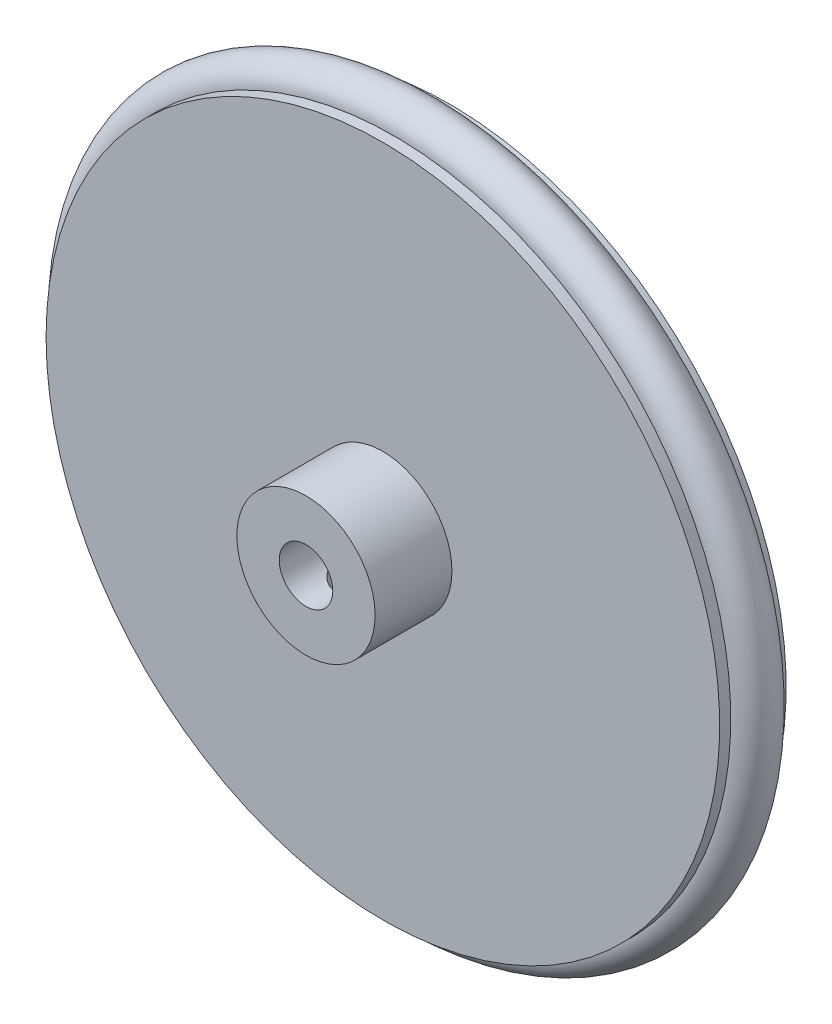
ISO-10303-21;
HEADER;
FILE_DESCRIPTION(('STEP AP214'),'2;1');
FILE_NAME('part.step','',(''),(''),'','','');
FILE_SCHEMA(('AUTOMOTIVE_DESIGN { 1 0 10303 214 1 1 1 1 }'));
ENDSEC;
DATA;
#1=APPLICATION_CONTEXT('core data for automotive mechanical design processes');
#2=APPLICATION_PROTOCOL_DEFINITION('international standard','automotive_design',2000,#1);
#3=PRODUCT_CONTEXT('',#1,'mechanical');
#4=PRODUCT('Part','Part','',(#3));
#5=PRODUCT_RELATED_PRODUCT_CATEGORY('part','',(#4));
#6=PRODUCT_DEFINITION_FORMATION('','',#4);
#7=PRODUCT_DEFINITION_CONTEXT('part definition',#1,'design');
#8=PRODUCT_DEFINITION('design','',#6,#7);
#9=PRODUCT_DEFINITION_SHAPE('','',#8);
#10=(LENGTH_UNIT() NAMED_UNIT(*) SI_UNIT(.MILLI.,.METRE.));
#11=(NAMED_UNIT(*) PLANE_ANGLE_UNIT() SI_UNIT($,.RADIAN.));
#12=(NAMED_UNIT(*) SI_UNIT($,.STERADIAN.) SOLID_ANGLE_UNIT());
#13=UNCERTAINTY_MEASURE_WITH_UNIT(LENGTH_MEASURE(1.E-05),#10,'distance_accuracy_value','');
#14=(GEOMETRIC_REPRESENTATION_CONTEXT(3) GLOBAL_UNCERTAINTY_ASSIGNED_CONTEXT((#13)) GLOBAL_UNIT_ASSIGNED_CONTEXT((#10,
#11,#12)) REPRESENTATION_CONTEXT('',''));
#15=CARTESIAN_POINT('',(0.,0.,0.));
#16=DIRECTION('',(0.,0.,1.));
#17=DIRECTION('',(1.,0.,0.));
#18=AXIS2_PLACEMENT_3D('',#15,#16,#17);
#19=CARTESIAN_POINT('',(0.,0.,3.85));
#20=DIRECTION('',(0.,0.,-1.));
#21=DIRECTION('',(-1.,0.,0.));
#22=AXIS2_PLACEMENT_3D('',#19,#20,#21);
#23=CYLINDRICAL_SURFACE('',#22,39.);
#24=CARTESIAN_POINT('',(0.,0.,2.56123692555145));
#25=DIRECTION('',(0.,0.,-1.));
#26=DIRECTION('',(-1.,0.,0.));
#27=AXIS2_PLACEMENT_3D('',#24,#25,#26);
#28=CIRCLE('',#27,39.);
#29=CARTESIAN_POINT('',(-39.,0.,2.56123692555145));
#30=VERTEX_POINT('',#29);
#31=EDGE_CURVE('E65',#30,#30,#28,.F.);
#32=CARTESIAN_POINT('',(0.,0.,3.85));
#33=DIRECTION('',(0.,0.,1.));
#34=DIRECTION('',(1.,0.,0.));
#35=AXIS2_PLACEMENT_3D('',#32,#33,#34);
#36=CIRCLE('',#35,39.);
#37=CARTESIAN_POINT('',(-39.,0.,3.85));
#38=VERTEX_POINT('',#37);
#39=EDGE_CURVE('E45',#38,#38,#36,.T.);
#40=CARTESIAN_POINT('',(-39.,0.,2.56123692555145));
#41=CARTESIAN_POINT('',(-39.,0.,2.57466154091029));
#42=CARTESIAN_POINT('',(-39.,0.,2.58808615626913));
#43=CARTESIAN_POINT('',(-39.,0.,2.61493538698681));
#44=CARTESIAN_POINT('',(-39.,0.,2.62836000234565));
#45=CARTESIAN_POINT('',(-39.,0.,2.65520923306333));
#46=CARTESIAN_POINT('',(-39.,0.,2.66863384842216));
#47=CARTESIAN_POINT('',(-39.,0.,2.69548307913984));
#48=CARTESIAN_POINT('',(-39.,0.,2.70890769449868));
#49=CARTESIAN_POINT('',(-39.,0.,2.73575692521636));
#50=CARTESIAN_POINT('',(-39.,0.,2.7491815405752));
#51=CARTESIAN_POINT('',(-39.,0.,2.77603077129288));
#52=CARTESIAN_POINT('',(-39.,0.,2.78945538665172));
#53=CARTESIAN_POINT('',(-39.,0.,2.81630461736939));
#54=CARTESIAN_POINT('',(-39.,0.,2.82972923272823));
#55=CARTESIAN_POINT('',(-39.,0.,2.85657846344591));
#56=CARTESIAN_POINT('',(-39.,0.,2.87000307880475));
#57=CARTESIAN_POINT('',(-39.,0.,2.89685230952243));
#58=CARTESIAN_POINT('',(-39.,0.,2.91027692488127));
#59=CARTESIAN_POINT('',(-39.,0.,2.93712615559894));
#60=CARTESIAN_POINT('',(-39.,0.,2.95055077095778));
#61=CARTESIAN_POINT('',(-39.,0.,2.97740000167546));
#62=CARTESIAN_POINT('',(-39.,0.,2.9908246170343));
#63=CARTESIAN_POINT('',(-39.,0.,3.01767384775198));
#64=CARTESIAN_POINT('',(-39.,0.,3.03109846311082));
#65=CARTESIAN_POINT('',(-39.,0.,3.0579476938285));
#66=CARTESIAN_POINT('',(-39.,0.,3.07137230918734));
#67=CARTESIAN_POINT('',(-39.,0.,3.09822153990501));
#68=CARTESIAN_POINT('',(-39.,0.,3.11164615526385));
#69=CARTESIAN_POINT('',(-39.,0.,3.13849538598153));
#70=CARTESIAN_POINT('',(-39.,0.,3.15192000134037));
#71=CARTESIAN_POINT('',(-39.,0.,3.17876923205805));
#72=CARTESIAN_POINT('',(-39.,0.,3.19219384741689));
#73=CARTESIAN_POINT('',(-39.,0.,3.21904307813457));
#74=CARTESIAN_POINT('',(-39.,0.,3.2324676934934));
#75=CARTESIAN_POINT('',(-39.,0.,3.25931692421108));
#76=CARTESIAN_POINT('',(-39.,0.,3.27274153956992));
#77=CARTESIAN_POINT('',(-39.,0.,3.2995907702876));
#78=CARTESIAN_POINT('',(-39.,0.,3.31301538564644));
#79=CARTESIAN_POINT('',(-39.,0.,3.33986461636412));
#80=CARTESIAN_POINT('',(-39.,0.,3.35328923172296));
#81=CARTESIAN_POINT('',(-39.,0.,3.38013846244063));
#82=CARTESIAN_POINT('',(-39.,0.,3.39356307779947));
#83=CARTESIAN_POINT('',(-39.,0.,3.42041230851715));
#84=CARTESIAN_POINT('',(-39.,0.,3.43383692387599));
#85=CARTESIAN_POINT('',(-39.,0.,3.46068615459367));
#86=CARTESIAN_POINT('',(-39.,0.,3.47411076995251));
#87=CARTESIAN_POINT('',(-39.,0.,3.50096000067018));
#88=CARTESIAN_POINT('',(-39.,0.,3.51438461602902));
#89=CARTESIAN_POINT('',(-39.,0.,3.5412338467467));
#90=CARTESIAN_POINT('',(-39.,0.,3.55465846210554));
#91=CARTESIAN_POINT('',(-39.,0.,3.58150769282322));
#92=CARTESIAN_POINT('',(-39.,0.,3.59493230818206));
#93=CARTESIAN_POINT('',(-39.,0.,3.62178153889974));
#94=CARTESIAN_POINT('',(-39.,0.,3.63520615425858));
#95=CARTESIAN_POINT('',(-39.,0.,3.66205538497625));
#96=CARTESIAN_POINT('',(-39.,0.,3.67548000033509));
#97=CARTESIAN_POINT('',(-39.,0.,3.70232923105277));
#98=CARTESIAN_POINT('',(-39.,0.,3.71575384641161));
#99=CARTESIAN_POINT('',(-39.,0.,3.74260307712929));
#100=CARTESIAN_POINT('',(-39.,0.,3.75602769248813));
#101=CARTESIAN_POINT('',(-39.,0.,3.78287692320581));
#102=CARTESIAN_POINT('',(-39.,0.,3.79630153856464));
#103=CARTESIAN_POINT('',(-39.,0.,3.82315076928232));
#104=CARTESIAN_POINT('',(-39.,0.,3.83657538464116));
#105=CARTESIAN_POINT('',(-39.,0.,3.85));
#106=B_SPLINE_CURVE_WITH_KNOTS('',3,(#40,#41,#42,#43,#44,#45,#46,#47,#48,#49,#50,#51,#52,#53,
#54,#55,#56,#57,#58,#59,#60,#61,#62,#63,#64,#65,#66,#67,#68,#69,#70,#71,#72,#73,#74,#75,#76,#77,
#78,#79,#80,#81,#82,#83,#84,#85,#86,#87,#88,#89,#90,#91,#92,#93,#94,#95,#96,#97,#98,#99,#100,
#101,#102,#103,#104,#105),.UNSPECIFIED.,.F.,.F.,(4,2,2,2,2,2,2,2,2,2,2,2,2,2,2,2,2,2,2,2,2,2,2,
2,2,2,2,2,2,2,2,2,4),(0.,0.040273846076517,0.0805476921530339,0.120821538229551,
0.161095384306068,0.201369230382585,0.241643076459103,0.28191692253562,0.322190768612137,
0.362464614688654,0.402738460765171,0.443012306841688,0.483286152918205,0.523559998994722,
0.56383384507124,0.604107691147757,0.644381537224274,0.684655383300791,0.724929229377308,
0.765203075453825,0.805476921530342,0.845750767606859,0.886024613683377,0.926298459759894,
0.966572305836411,1.00684615191293,1.04711999798944,1.08739384406596,1.12766769014248,
1.167941536219,1.20821538229551,1.24848922837203,1.28876307444855),.UNSPECIFIED.);
#107=EDGE_CURVE('BSEAM37',#30,#38,#106,.T.);
#108=ORIENTED_EDGE('',*,*,#31,.T.);
#109=ORIENTED_EDGE('',*,*,#39,.F.);
#110=ORIENTED_EDGE('',*,*,#107,.T.);
#111=ORIENTED_EDGE('',*,*,#107,.F.);
#112=EDGE_LOOP('',(#108,#110,#109,#111));
#113=FACE_BOUND('',#112,.T.);
#114=ADVANCED_FACE('F37',(#113),#23,.T.);
#115=CARTESIAN_POINT('',(0.,0.,3.85));
#116=DIRECTION('',(0.,0.,1.));
#117=DIRECTION('',(1.,0.,0.));
#118=AXIS2_PLACEMENT_3D('',#115,#116,#117);
#119=PLANE('',#118);
#120=CARTESIAN_POINT('',(0.,0.,3.85));
#121=DIRECTION('',(0.,0.,1.));
#122=DIRECTION('',(1.,0.,0.));
#123=AXIS2_PLACEMENT_3D('',#120,#121,#122);
#124=CIRCLE('',#123,8.);
#125=CARTESIAN_POINT('',(8.,0.,3.85));
#126=VERTEX_POINT('',#125);
#127=EDGE_CURVE('E11',#126,#126,#124,.T.);
#128=ORIENTED_EDGE('',*,*,#127,.F.);
#129=EDGE_LOOP('',(#128));
#130=FACE_BOUND('',#129,.T.);
#131=ORIENTED_EDGE('',*,*,#39,.T.);
#132=EDGE_LOOP('',(#131));
#133=FACE_BOUND('',#132,.T.);
#134=ADVANCED_FACE('F92',(#130,#133),#119,.T.);
#135=CARTESIAN_POINT('',(0.,0.,12.75));
#136=DIRECTION('',(0.,0.,-1.));
#137=DIRECTION('',(-1.,0.,0.));
#138=AXIS2_PLACEMENT_3D('',#135,#136,#137);
#139=CYLINDRICAL_SURFACE('',#138,8.);
#140=CARTESIAN_POINT('',(0.,-8.,9.5));
#141=CARTESIAN_POINT('',(0.110501451559641,-7.9999981315735,9.49999689901579));
#142=CARTESIAN_POINT('',(0.221037543774351,-7.99768770842435,9.49081126563495));
#143=CARTESIAN_POINT('',(0.438941765027377,-7.98869485106526,9.45436646492399));
#144=CARTESIAN_POINT('',(0.546308062494319,-7.98200993893301,9.42709705394953));
#145=CARTESIAN_POINT('',(0.754694496243435,-7.96500835109376,9.35541432871722));
#146=CARTESIAN_POINT('',(0.855722084573336,-7.95469603789411,9.31102160171297));
#147=CARTESIAN_POINT('',(1.04889617587257,-7.93153791743495,9.20642481327354));
#148=CARTESIAN_POINT('',(1.14104237913168,-7.91869202472209,9.14622021850805));
#149=CARTESIAN_POINT('',(1.31573590306789,-7.89156551455591,9.01039894712776));
#150=CARTESIAN_POINT('',(1.39807425341474,-7.87726276197502,8.93451790005459));
#151=CARTESIAN_POINT('',(1.54899856960443,-7.84898160157248,8.77006372678795));
#152=CARTESIAN_POINT('',(1.61758298259892,-7.83500323053157,8.68148916940408));
#153=CARTESIAN_POINT('',(1.74003539039863,-7.80873034264225,8.49253969768401));
#154=CARTESIAN_POINT('',(1.79366962123352,-7.79646392619748,8.39200902558836));
#155=CARTESIAN_POINT('',(1.88319587806766,-7.77532659757355,8.18300211778662));
#156=CARTESIAN_POINT('',(1.91909074058685,-7.76645514259225,8.07452715555731));
#157=CARTESIAN_POINT('',(1.97140644907302,-7.7533396892843,7.85500866906446));
#158=CARTESIAN_POINT('',(1.98820302444274,-7.74900654662681,7.74406013861601));
#159=CARTESIAN_POINT('',(2.00301570008854,-7.74519149946122,7.52084190800087));
#160=CARTESIAN_POINT('',(2.00103485575748,-7.74570880570571,7.40857242574382));
#161=CARTESIAN_POINT('',(1.97864869951961,-7.75145607355756,7.1887789230062));
#162=CARTESIAN_POINT('',(1.95869112025418,-7.75657150676391,7.08120583804623));
#163=CARTESIAN_POINT('',(1.90163224920399,-7.77075612894758,6.87098526545192));
#164=CARTESIAN_POINT('',(1.86452973609252,-7.77982559958985,6.76833812929477));
#165=CARTESIAN_POINT('',(1.77385263724958,-7.80100151874212,6.56968264499716));
#166=CARTESIAN_POINT('',(1.72011555631056,-7.81313769959755,6.47375177094724));
#167=CARTESIAN_POINT('',(1.59780836801993,-7.83906281127988,6.29210838699091));
#168=CARTESIAN_POINT('',(1.52923566507845,-7.85285203112837,6.20639766924367));
#169=CARTESIAN_POINT('',(1.37688456624163,-7.88101174053188,6.04506184574079));
#170=CARTESIAN_POINT('',(1.29272834422115,-7.89538759304001,5.96979401325153));
#171=CARTESIAN_POINT('',(1.11281589000493,-7.92274620771675,5.8343716767148));
#172=CARTESIAN_POINT('',(1.01705930361059,-7.93572892732543,5.77421763431525));
#173=CARTESIAN_POINT('',(0.816154518241855,-7.9589030945892,5.67059921836749));
#174=CARTESIAN_POINT('',(0.710975190944831,-7.96908480170303,5.62719287966076));
#175=CARTESIAN_POINT('',(0.49450134419051,-7.98543889321888,5.55877692572057));
#176=CARTESIAN_POINT('',(0.383207998867312,-7.99161204452374,5.53376379144248));
#177=CARTESIAN_POINT('',(0.160719960520035,-7.999139990285,5.50338991258822));
#178=CARTESIAN_POINT('',(0.0495956266509452,-8.00061404677705,5.4975426318996));
#179=CARTESIAN_POINT('',(-0.172043833068678,-7.99891739752601,5.50433200274065));
#180=CARTESIAN_POINT('',(-0.282559012859461,-7.99574710989128,5.51696699039884));
#181=CARTESIAN_POINT('',(-0.498152358368656,-7.98519441503143,5.55996121118851));
#182=CARTESIAN_POINT('',(-0.603286825291673,-7.97787512247748,5.59005501796932));
#183=CARTESIAN_POINT('',(-0.807009723270016,-7.95984942178845,5.66680944537126));
#184=CARTESIAN_POINT('',(-0.905597492043513,-7.94914267159856,5.71347173908423));
#185=CARTESIAN_POINT('',(-1.0953641792398,-7.92524410568414,5.82298150516631));
#186=CARTESIAN_POINT('',(-1.18638058911444,-7.91201156489243,5.88610148319569));
#187=CARTESIAN_POINT('',(-1.35670215152433,-7.88459345583226,6.02638654506263));
#188=CARTESIAN_POINT('',(-1.43600527863068,-7.87040772335606,6.10355405282254));
#189=CARTESIAN_POINT('',(-1.58265409076364,-7.84225275947695,6.27200261445929));
#190=CARTESIAN_POINT('',(-1.64965849016271,-7.82829738916375,6.36358360400323));
#191=CARTESIAN_POINT('',(-1.7673476786836,-7.80257171169652,6.55697684595429));
#192=CARTESIAN_POINT('',(-1.81803319221058,-7.79080130756035,6.65878864394634));
#193=CARTESIAN_POINT('',(-1.90126856081239,-7.77090792979553,6.86920762988411));
#194=CARTESIAN_POINT('',(-1.93392586220542,-7.76276340389207,6.97777017112535));
#195=CARTESIAN_POINT('',(-1.98046087993837,-7.75102325453578,7.19907951718548));
#196=CARTESIAN_POINT('',(-1.99434270330488,-7.74742663626581,7.31182540137666));
#197=CARTESIAN_POINT('',(-2.00271812044533,-7.74526534938609,7.53482803180694));
#198=CARTESIAN_POINT('',(-1.99775719704016,-7.74655910304352,7.64506324683298));
#199=CARTESIAN_POINT('',(-1.96983637108382,-7.7537054534379,7.86307185155731));
#200=CARTESIAN_POINT('',(-1.94687683024903,-7.75955795855809,7.97084529068487));
#201=CARTESIAN_POINT('',(-1.88390842592373,-7.77508347576963,8.18027794542055));
#202=CARTESIAN_POINT('',(-1.84400187290717,-7.78473353648412,8.28196974032028));
#203=CARTESIAN_POINT('',(-1.74835321814009,-7.80677007633105,8.47728717695159));
#204=CARTESIAN_POINT('',(-1.69260892004558,-7.81915693494364,8.57091169758256));
#205=CARTESIAN_POINT('',(-1.56515699818285,-7.8456751235135,8.75007283866936));
#206=CARTESIAN_POINT('',(-1.493070883883,-7.85984353109009,8.83533476456528));
#207=CARTESIAN_POINT('',(-1.33571916158631,-7.88810702995048,8.99272939306054));
#208=CARTESIAN_POINT('',(-1.25045042834819,-7.90220210302746,9.06485897348396));
#209=CARTESIAN_POINT('',(-1.06729011560345,-7.92903540863551,9.19521507808614));
#210=CARTESIAN_POINT('',(-0.969197896421848,-7.94174444487824,9.25316615156211));
#211=CARTESIAN_POINT('',(-0.764354746013967,-7.96406566633491,9.35166328392071));
#212=CARTESIAN_POINT('',(-0.657610084582319,-7.97368006933042,9.39222181419805));
#213=CARTESIAN_POINT('',(-0.459213670991295,-7.98730746087389,9.44876244043954));
#214=CARTESIAN_POINT('',(-0.368506894544092,-7.9920344673692,9.46793499073791));
#215=CARTESIAN_POINT('',(-0.185208095381711,-7.99838140309264,9.49355459149592));
#216=CARTESIAN_POINT('',(-0.0926162149901552,-8.00000156601192,9.50000259907373));
#217=CARTESIAN_POINT('',(0.,-8.,9.5));
#218=B_SPLINE_CURVE_WITH_KNOTS('',3,(#140,#141,#142,#143,#144,#145,#146,#147,#148,#149,#150,
#151,#152,#153,#154,#155,#156,#157,#158,#159,#160,#161,#162,#163,#164,#165,#166,#167,#168,#169,
#170,#171,#172,#173,#174,#175,#176,#177,#178,#179,#180,#181,#182,#183,#184,#185,#186,#187,#188,
#189,#190,#191,#192,#193,#194,#195,#196,#197,#198,#199,#200,#201,#202,#203,#204,#205,#206,#207,
#208,#209,#210,#211,#212,#213,#214,#215,#216,#217),.UNSPECIFIED.,.T.,.F.,(4,2,2,2,2,2,2,2,2,2,2,
2,2,2,2,2,2,2,2,2,2,2,2,2,2,2,2,2,2,2,2,2,2,2,2,2,2,2,4),(0.,0.331164949962519,
0.662517650351866,0.993473203048141,1.32443992022577,1.66152580582852,1.99864972773416,
2.34078196727742,2.68285948225824,3.01808393468093,3.3532538415469,3.68029996013785,
4.00736937959146,4.337740371696,4.66816921119311,5.00802001296453,5.34788119415424,
5.6889097201658,6.02987298255951,6.36211078603463,6.69431868154752,7.02160366023144,
7.34892169767482,7.68204783424897,8.01523150681786,8.35659345610396,8.69794025003772,
9.03723006156476,9.37644564340971,9.70591707202578,10.0353818794581,10.3628853408369,
10.6904342418696,11.0265276855097,11.3627009303165,11.7049624733721,12.0469781843289,
12.3245632392729,12.6021274139515),.UNSPECIFIED.);
#219=CARTESIAN_POINT('',(0.,-8.,9.5));
#220=VERTEX_POINT('',#219);
#221=EDGE_CURVE('E64',#220,#220,#218,.T.);
#222=ORIENTED_EDGE('',*,*,#221,.T.);
#223=EDGE_LOOP('',(#222));
#224=FACE_BOUND('',#223,.T.);
#225=CARTESIAN_POINT('',(0.,0.,12.75));
#226=DIRECTION('',(0.,0.,1.));
#227=DIRECTION('',(1.,0.,0.));
#228=AXIS2_PLACEMENT_3D('',#225,#226,#227);
#229=CIRCLE('',#228,8.);
#230=CARTESIAN_POINT('',(8.,0.,12.75));
#231=VERTEX_POINT('',#230);
#232=EDGE_CURVE('E53',#231,#231,#229,.T.);
#233=ORIENTED_EDGE('',*,*,#232,.F.);
#234=EDGE_LOOP('',(#233));
#235=FACE_BOUND('',#234,.T.);
#236=ORIENTED_EDGE('',*,*,#127,.T.);
#237=EDGE_LOOP('',(#236));
#238=FACE_BOUND('',#237,.T.);
#239=ADVANCED_FACE('F87',(#224,#235,#238),#139,.T.);
#240=CARTESIAN_POINT('',(0.,0.,12.75));
#241=DIRECTION('',(0.,0.,1.));
#242=DIRECTION('',(1.,0.,0.));
#243=AXIS2_PLACEMENT_3D('',#240,#241,#242);
#244=PLANE('',#243);
#245=CARTESIAN_POINT('',(0.,0.,12.75));
#246=DIRECTION('',(0.,0.,1.));
#247=DIRECTION('',(1.,0.,0.));
#248=AXIS2_PLACEMENT_3D('',#245,#246,#247);
#249=CIRCLE('',#248,3.1);
#250=CARTESIAN_POINT('',(3.1,0.,12.75));
#251=VERTEX_POINT('',#250);
#252=EDGE_CURVE('E86',#251,#251,#249,.T.);
#253=ORIENTED_EDGE('',*,*,#252,.F.);
#254=EDGE_LOOP('',(#253));
#255=FACE_BOUND('',#254,.T.);
#256=ORIENTED_EDGE('',*,*,#232,.T.);
#257=EDGE_LOOP('',(#256));
#258=FACE_BOUND('',#257,.T.);
#259=ADVANCED_FACE('F91',(#255,#258),#244,.T.);
#260=CARTESIAN_POINT('',(0.,0.,-12.6181240867132));
#261=DIRECTION('',(0.,0.,1.));
#262=DIRECTION('',(1.,0.,0.));
#263=AXIS2_PLACEMENT_3D('',#260,#261,#262);
#264=CYLINDRICAL_SURFACE('',#263,3.1);
#265=CARTESIAN_POINT('',(0.,-3.1,9.5));
#266=CARTESIAN_POINT('',(-0.101091385039777,-3.09999460939274,9.49999423985456));
#267=CARTESIAN_POINT('',(-0.202236134564494,-3.09500777365122,9.49228861003426));
#268=CARTESIAN_POINT('',(-0.40134422219677,-3.07554251080367,9.46191052513201));
#269=CARTESIAN_POINT('',(-0.499304337672782,-3.0610547651011,9.43922337585951));
#270=CARTESIAN_POINT('',(-0.688847609969658,-3.02403316266577,9.38023929755381));
#271=CARTESIAN_POINT('',(-0.780458562332545,-3.00153742435718,9.34400680467486));
#272=CARTESIAN_POINT('',(-0.955964244967446,-2.95033924070804,9.25944096599089));
#273=CARTESIAN_POINT('',(-1.03985843062382,-2.9216363577727,9.21110676699504));
#274=CARTESIAN_POINT('',(-1.20534975085783,-2.85755815418126,9.09934687867213));
#275=CARTESIAN_POINT('',(-1.28618869122808,-2.82182799524603,9.0350061395549));
#276=CARTESIAN_POINT('',(-1.43665631544782,-2.74828108070154,8.89520120954714));
#277=CARTESIAN_POINT('',(-1.50626924383573,-2.71046149080006,8.81972166508535));
#278=CARTESIAN_POINT('',(-1.64268679943019,-2.63034253686168,8.64691651791072));
#279=CARTESIAN_POINT('',(-1.70759476074744,-2.58819607847858,8.54801033709484));
#280=CARTESIAN_POINT('',(-1.81972592440112,-2.51062817225813,8.33825819113032));
#281=CARTESIAN_POINT('',(-1.86697956402236,-2.47519520238284,8.2274332037925));
#282=CARTESIAN_POINT('',(-1.93115046035712,-2.42525032881529,8.02768249145855));
#283=CARTESIAN_POINT('',(-1.95283049983355,-2.40766682164749,7.94106125555081));
#284=CARTESIAN_POINT('',(-1.98446592184547,-2.38166474413427,7.76441515405156));
#285=CARTESIAN_POINT('',(-1.99443957013961,-2.37323189735386,7.67439581776609));
#286=CARTESIAN_POINT('',(-2.00204983941226,-2.36681793758445,7.49315258210891));
#287=CARTESIAN_POINT('',(-1.99964615392167,-2.36887097141953,7.4019257134594));
#288=CARTESIAN_POINT('',(-1.98258006769263,-2.38316799120796,7.2214121827045));
#289=CARTESIAN_POINT('',(-1.96790747526994,-2.39542044970509,7.13212719699272));
#290=CARTESIAN_POINT('',(-1.92786567346179,-2.42774793365928,6.9607019055138));
#291=CARTESIAN_POINT('',(-1.9028579256027,-2.44755702424853,6.87842389978763));
#292=CARTESIAN_POINT('',(-1.84321796757953,-2.49277853296268,6.71910848586362));
#293=CARTESIAN_POINT('',(-1.80858257660194,-2.51819280237145,6.64207282013664));
#294=CARTESIAN_POINT('',(-1.72290696910724,-2.5777531470504,6.47940367147485));
#295=CARTESIAN_POINT('',(-1.66998346799092,-2.61263498659573,6.39503299514242));
#296=CARTESIAN_POINT('',(-1.55262072653794,-2.68404531595956,6.2354053931168));
#297=CARTESIAN_POINT('',(-1.48816769918918,-2.72057573761244,6.16015956168707));
#298=CARTESIAN_POINT('',(-1.33531850150805,-2.79921977867378,6.00641965469216));
#299=CARTESIAN_POINT('',(-1.2446991971314,-2.84108811643832,5.92998603795691));
#300=CARTESIAN_POINT('',(-1.04963410942446,-2.91877600894092,5.79342507092218));
#301=CARTESIAN_POINT('',(-0.945202988602563,-2.95460188779143,5.73328063171092));
#302=CARTESIAN_POINT('',(-0.746639365899209,-3.01014273026213,5.64204748666379));
#303=CARTESIAN_POINT('',(-0.65456737995395,-3.03164347825907,5.6075627187463));
#304=CARTESIAN_POINT('',(-0.464930213104867,-3.06644845105128,5.55229077747468));
#305=CARTESIAN_POINT('',(-0.367369568656605,-3.07975933933833,5.53149246748689));
#306=CARTESIAN_POINT('',(-0.169045410576032,-3.0969921575555,5.50463832866688));
#307=CARTESIAN_POINT('',(-0.0682718516736113,-3.10088094883133,5.49863453267088));
#308=CARTESIAN_POINT('',(0.132930127327373,-3.0987818893615,5.50188808806102));
#309=CARTESIAN_POINT('',(0.233358534619953,-3.09279367603535,5.51114599969775));
#310=CARTESIAN_POINT('',(0.425119290519885,-3.0721423509695,5.54342154508947));
#311=CARTESIAN_POINT('',(0.51664537144639,-3.05798682310753,5.56563483512585));
#312=CARTESIAN_POINT('',(0.694421792387248,-3.02258192723568,5.62210647387215));
#313=CARTESIAN_POINT('',(0.780671246170739,-3.00133137143629,5.65636683945258));
#314=CARTESIAN_POINT('',(0.952313130749649,-2.95155061853353,5.73852436888356));
#315=CARTESIAN_POINT('',(1.03719832856589,-2.92260695610669,5.78722473299525));
#316=CARTESIAN_POINT('',(1.19797699917457,-2.86047105425269,5.89554882406114));
#317=CARTESIAN_POINT('',(1.27386369806246,-2.82727565280704,5.95518069515739));
#318=CARTESIAN_POINT('',(1.42679573254823,-2.75363680286679,6.09411453626771));
#319=CARTESIAN_POINT('',(1.502217991591,-2.71286465557268,6.17503157595802));
#320=CARTESIAN_POINT('',(1.63901758369639,-2.63247341235496,6.34855184705935));
#321=CARTESIAN_POINT('',(1.70039095540679,-2.59285464439052,6.44115836314992));
#322=CARTESIAN_POINT('',(1.80081056775826,-2.5239466231388,6.62446981638804));
#323=CARTESIAN_POINT('',(1.84170928019883,-2.49398430191481,6.71390042775378));
#324=CARTESIAN_POINT('',(1.91037132253394,-2.44179234650511,6.8997766615712));
#325=CARTESIAN_POINT('',(1.93815244113827,-2.41955225114483,6.99621257806556));
#326=CARTESIAN_POINT('',(1.97925302886152,-2.38606269457456,7.19512500607156));
#327=CARTESIAN_POINT('',(1.99242553477726,-2.37492503520893,7.29765216173333));
#328=CARTESIAN_POINT('',(2.00265608987801,-2.36631138405995,7.50404792910151));
#329=CARTESIAN_POINT('',(1.99972843393145,-2.36882327321338,7.60791526916267));
#330=CARTESIAN_POINT('',(1.97974948336216,-2.385519162785,7.79704235785586));
#331=CARTESIAN_POINT('',(1.96492208911016,-2.39786312632663,7.88272249216542));
#332=CARTESIAN_POINT('',(1.92478575684782,-2.43019785844483,8.05010808712704));
#333=CARTESIAN_POINT('',(1.8994662269818,-2.45019635274102,8.13180943777216));
#334=CARTESIAN_POINT('',(1.8289643349275,-2.50348562062322,8.31720982840996));
#335=CARTESIAN_POINT('',(1.77994565236697,-2.53898245001553,8.41881180681012));
#336=CARTESIAN_POINT('',(1.66665742988777,-2.61474699558477,8.61119491391551));
#337=CARTESIAN_POINT('',(1.60236450988041,-2.65502197783671,8.70195913016394));
#338=CARTESIAN_POINT('',(1.45888519845899,-2.73652246794838,8.87267718655171));
#339=CARTESIAN_POINT('',(1.37951440481604,-2.77775351345464,8.95247350407429));
#340=CARTESIAN_POINT('',(1.20753038667599,-2.85671179204102,9.09829677390185));
#341=CARTESIAN_POINT('',(1.11492957876487,-2.89444225631806,9.16433649573719));
#342=CARTESIAN_POINT('',(0.930076713789365,-2.95860078482454,9.27341698597728));
#343=CARTESIAN_POINT('',(0.839194900302701,-2.98584930398292,9.318291150779));
#344=CARTESIAN_POINT('',(0.650002847052295,-3.03264637260129,9.39415954682018));
#345=CARTESIAN_POINT('',(0.551704291854859,-3.05220674429459,9.42517509888306));
#346=CARTESIAN_POINT('',(0.377584832422472,-3.07781554283967,9.46548062779998));
#347=CARTESIAN_POINT('',(0.30291009649643,-3.08609090810034,9.47838335273191));
#348=CARTESIAN_POINT('',(0.15216703635602,-3.09718531112089,9.49564543467788));
#349=CARTESIAN_POINT('',(0.0760986380390963,-3.10000405789149,9.50000433606902));
#350=CARTESIAN_POINT('',(0.,-3.1,9.5));
#351=B_SPLINE_CURVE_WITH_KNOTS('',3,(#265,#266,#267,#268,#269,#270,#271,#272,#273,#274,#275,
#276,#277,#278,#279,#280,#281,#282,#283,#284,#285,#286,#287,#288,#289,#290,#291,#292,#293,#294,
#295,#296,#297,#298,#299,#300,#301,#302,#303,#304,#305,#306,#307,#308,#309,#310,#311,#312,#313,
#314,#315,#316,#317,#318,#319,#320,#321,#322,#323,#324,#325,#326,#327,#328,#329,#330,#331,#332,
#333,#334,#335,#336,#337,#338,#339,#340,#341,#342,#343,#344,#345,#346,#347,#348,#349,#350),
.UNSPECIFIED.,.T.,.F.,(4,2,2,2,2,2,2,2,2,2,2,2,2,2,2,2,2,2,2,2,2,2,2,2,2,2,2,2,2,2,2,2,2,2,2,2,
2,2,2,2,2,2,4),(0.,0.302966311138187,0.606230220275506,0.908069468488516,1.20993000287647,
1.53665065809857,1.86382594121082,2.23880818267474,2.61314091205647,2.88505518621458,
3.15654461969954,3.42891870954099,3.70151928342565,3.96529957222992,4.22916711345738,
4.54461288083483,4.86043841114649,5.23578572642889,5.61073772744286,5.91138256881843,
6.21178247281048,6.51323739565213,6.814703385018,7.09919018653744,7.38372463832978,
7.68871147259943,7.99392645710977,8.34616896663427,8.69851067565524,9.00574516973998,
9.31256181935081,9.62243782101927,9.9320387371862,10.1943851218243,10.4569969939451,
10.8099170659531,11.1633808690887,11.521483908107,11.8792530427354,12.1928227029758,
12.5059082759399,12.7339602929413,12.9620244711131),.UNSPECIFIED.);
#352=CARTESIAN_POINT('',(0.,-3.1,9.5));
#353=VERTEX_POINT('',#352);
#354=EDGE_CURVE('E57',#353,#353,#351,.T.);
#355=ORIENTED_EDGE('',*,*,#354,.T.);
#356=EDGE_LOOP('',(#355));
#357=FACE_BOUND('',#356,.T.);
#358=CARTESIAN_POINT('',(0.,0.,-2.85));
#359=DIRECTION('',(0.,0.,1.));
#360=DIRECTION('',(1.,0.,0.));
#361=AXIS2_PLACEMENT_3D('',#358,#359,#360);
#362=CIRCLE('',#361,3.1);
#363=CARTESIAN_POINT('',(3.1,0.,-2.85));
#364=VERTEX_POINT('',#363);
#365=EDGE_CURVE('E203',#364,#364,#362,.F.);
#366=ORIENTED_EDGE('',*,*,#365,.T.);
#367=EDGE_LOOP('',(#366));
#368=FACE_BOUND('',#367,.T.);
#369=ORIENTED_EDGE('',*,*,#252,.T.);
#370=EDGE_LOOP('',(#369));
#371=FACE_BOUND('',#370,.T.);
#372=ADVANCED_FACE('F66',(#357,#368,#371),#264,.F.);
#373=CARTESIAN_POINT('',(0.,0.,-2.85));
#374=DIRECTION('',(0.,0.,1.));
#375=DIRECTION('',(1.,0.,0.));
#376=AXIS2_PLACEMENT_3D('',#373,#374,#375);
#377=PLANE('',#376);
#378=ORIENTED_EDGE('',*,*,#365,.F.);
#379=EDGE_LOOP('',(#378));
#380=FACE_BOUND('',#379,.T.);
#381=ADVANCED_FACE('F75',(#380),#377,.T.);
#382=CARTESIAN_POINT('',(0.,-39.,7.5));
#383=DIRECTION('',(0.,1.,0.));
#384=DIRECTION('',(0.,0.,1.));
#385=AXIS2_PLACEMENT_3D('',#382,#383,#384);
#386=CYLINDRICAL_SURFACE('',#385,2.);
#387=ORIENTED_EDGE('',*,*,#354,.F.);
#388=EDGE_LOOP('',(#387));
#389=FACE_BOUND('',#388,.T.);
#390=ORIENTED_EDGE('',*,*,#221,.F.);
#391=EDGE_LOOP('',(#390));
#392=FACE_BOUND('',#391,.T.);
#393=ADVANCED_FACE('F70',(#389,#392),#386,.F.);
#394=CARTESIAN_POINT('',(0.,0.,0.));
#395=DIRECTION('',(0.,0.,1.));
#396=DIRECTION('',(1.,0.,0.));
#397=AXIS2_PLACEMENT_3D('',#394,#395,#396);
#398=TOROIDAL_SURFACE('',#397,39.,2.56123692555145);
#399=ORIENTED_EDGE('',*,*,#31,.F.);
#400=EDGE_LOOP('',(#399));
#401=FACE_BOUND('',#400,.T.);
#402=CARTESIAN_POINT('',(0.,0.,-2.56123692555145));
#403=DIRECTION('',(0.,0.,1.));
#404=DIRECTION('',(1.,0.,0.));
#405=AXIS2_PLACEMENT_3D('',#402,#403,#404);
#406=CIRCLE('',#405,39.);
#407=CARTESIAN_POINT('',(-39.,0.,-2.56123692555145));
#408=VERTEX_POINT('',#407);
#409=EDGE_CURVE('E41',#408,#408,#406,.F.);
#410=ORIENTED_EDGE('',*,*,#409,.F.);
#411=EDGE_LOOP('',(#410));
#412=FACE_BOUND('',#411,.T.);
#413=ADVANCED_FACE('F74',(#401,#412),#398,.T.);
#414=CARTESIAN_POINT('',(0.,0.,-3.85));
#415=DIRECTION('',(0.,0.,1.));
#416=DIRECTION('',(1.,0.,0.));
#417=AXIS2_PLACEMENT_3D('',#414,#415,#416);
#418=PLANE('',#417);
#419=CARTESIAN_POINT('',(0.,0.,-3.85));
#420=DIRECTION('',(0.,0.,1.));
#421=DIRECTION('',(1.,0.,0.));
#422=AXIS2_PLACEMENT_3D('',#419,#420,#421);
#423=CIRCLE('',#422,39.);
#424=CARTESIAN_POINT('',(-39.,0.,-3.85));
#425=VERTEX_POINT('',#424);
#426=EDGE_CURVE('E50',#425,#425,#423,.T.);
#427=ORIENTED_EDGE('',*,*,#426,.F.);
#428=EDGE_LOOP('',(#427));
#429=FACE_BOUND('',#428,.T.);
#430=ADVANCED_FACE('F96',(#429),#418,.F.);
#431=CARTESIAN_POINT('',(-39.,0.,-2.56123692555145));
#432=CARTESIAN_POINT('',(-39.,0.,-2.57466154091029));
#433=CARTESIAN_POINT('',(-39.,0.,-2.58808615626913));
#434=CARTESIAN_POINT('',(-39.,0.,-2.61493538698681));
#435=CARTESIAN_POINT('',(-39.,0.,-2.62836000234565));
#436=CARTESIAN_POINT('',(-39.,0.,-2.65520923306332));
#437=CARTESIAN_POINT('',(-39.,0.,-2.66863384842216));
#438=CARTESIAN_POINT('',(-39.,0.,-2.69548307913984));
#439=CARTESIAN_POINT('',(-39.,0.,-2.70890769449868));
#440=CARTESIAN_POINT('',(-39.,0.,-2.73575692521636));
#441=CARTESIAN_POINT('',(-39.,0.,-2.7491815405752));
#442=CARTESIAN_POINT('',(-39.,0.,-2.77603077129288));
#443=CARTESIAN_POINT('',(-39.,0.,-2.78945538665172));
#444=CARTESIAN_POINT('',(-39.,0.,-2.81630461736939));
#445=CARTESIAN_POINT('',(-39.,0.,-2.82972923272823));
#446=CARTESIAN_POINT('',(-39.,0.,-2.85657846344591));
#447=CARTESIAN_POINT('',(-39.,0.,-2.87000307880475));
#448=CARTESIAN_POINT('',(-39.,0.,-2.89685230952243));
#449=CARTESIAN_POINT('',(-39.,0.,-2.91027692488127));
#450=CARTESIAN_POINT('',(-39.,0.,-2.93712615559894));
#451=CARTESIAN_POINT('',(-39.,0.,-2.95055077095778));
#452=CARTESIAN_POINT('',(-39.,0.,-2.97740000167546));
#453=CARTESIAN_POINT('',(-39.,0.,-2.9908246170343));
#454=CARTESIAN_POINT('',(-39.,0.,-3.01767384775198));
#455=CARTESIAN_POINT('',(-39.,0.,-3.03109846311082));
#456=CARTESIAN_POINT('',(-39.,0.,-3.0579476938285));
#457=CARTESIAN_POINT('',(-39.,0.,-3.07137230918734));
#458=CARTESIAN_POINT('',(-39.,0.,-3.09822153990501));
#459=CARTESIAN_POINT('',(-39.,0.,-3.11164615526385));
#460=CARTESIAN_POINT('',(-39.,0.,-3.13849538598153));
#461=CARTESIAN_POINT('',(-39.,0.,-3.15192000134037));
#462=CARTESIAN_POINT('',(-39.,0.,-3.17876923205805));
#463=CARTESIAN_POINT('',(-39.,0.,-3.19219384741689));
#464=CARTESIAN_POINT('',(-39.,0.,-3.21904307813457));
#465=CARTESIAN_POINT('',(-39.,0.,-3.2324676934934));
#466=CARTESIAN_POINT('',(-39.,0.,-3.25931692421108));
#467=CARTESIAN_POINT('',(-39.,0.,-3.27274153956992));
#468=CARTESIAN_POINT('',(-39.,0.,-3.2995907702876));
#469=CARTESIAN_POINT('',(-39.,0.,-3.31301538564644));
#470=CARTESIAN_POINT('',(-39.,0.,-3.33986461636412));
#471=CARTESIAN_POINT('',(-39.,0.,-3.35328923172296));
#472=CARTESIAN_POINT('',(-39.,0.,-3.38013846244063));
#473=CARTESIAN_POINT('',(-39.,0.,-3.39356307779947));
#474=CARTESIAN_POINT('',(-39.,0.,-3.42041230851715));
#475=CARTESIAN_POINT('',(-39.,0.,-3.43383692387599));
#476=CARTESIAN_POINT('',(-39.,0.,-3.46068615459367));
#477=CARTESIAN_POINT('',(-39.,0.,-3.47411076995251));
#478=CARTESIAN_POINT('',(-39.,0.,-3.50096000067019));
#479=CARTESIAN_POINT('',(-39.,0.,-3.51438461602902));
#480=CARTESIAN_POINT('',(-39.,0.,-3.5412338467467));
#481=CARTESIAN_POINT('',(-39.,0.,-3.55465846210554));
#482=CARTESIAN_POINT('',(-39.,0.,-3.58150769282322));
#483=CARTESIAN_POINT('',(-39.,0.,-3.59493230818206));
#484=CARTESIAN_POINT('',(-39.,0.,-3.62178153889974));
#485=CARTESIAN_POINT('',(-39.,0.,-3.63520615425858));
#486=CARTESIAN_POINT('',(-39.,0.,-3.66205538497625));
#487=CARTESIAN_POINT('',(-39.,0.,-3.67548000033509));
#488=CARTESIAN_POINT('',(-39.,0.,-3.70232923105277));
#489=CARTESIAN_POINT('',(-39.,0.,-3.71575384641161));
#490=CARTESIAN_POINT('',(-39.,0.,-3.74260307712929));
#491=CARTESIAN_POINT('',(-39.,0.,-3.75602769248813));
#492=CARTESIAN_POINT('',(-39.,0.,-3.78287692320581));
#493=CARTESIAN_POINT('',(-39.,0.,-3.79630153856464));
#494=CARTESIAN_POINT('',(-39.,0.,-3.82315076928232));
#495=CARTESIAN_POINT('',(-39.,0.,-3.83657538464116));
#496=CARTESIAN_POINT('',(-39.,0.,-3.85));
#497=B_SPLINE_CURVE_WITH_KNOTS('',3,(#431,#432,#433,#434,#435,#436,#437,#438,#439,#440,#441,
#442,#443,#444,#445,#446,#447,#448,#449,#450,#451,#452,#453,#454,#455,#456,#457,#458,#459,#460,
#461,#462,#463,#464,#465,#466,#467,#468,#469,#470,#471,#472,#473,#474,#475,#476,#477,#478,#479,
#480,#481,#482,#483,#484,#485,#486,#487,#488,#489,#490,#491,#492,#493,#494,#495,#496),
.UNSPECIFIED.,.F.,.F.,(4,2,2,2,2,2,2,2,2,2,2,2,2,2,2,2,2,2,2,2,2,2,2,2,2,2,2,2,2,2,2,2,4),(0.,
0.0402738460765174,0.0805476921530348,0.120821538229551,0.161095384306069,0.201369230382586,
0.241643076459103,0.28191692253562,0.322190768612137,0.362464614688655,0.402738460765172,
0.443012306841689,0.483286152918206,0.523559998994724,0.56383384507124,0.604107691147758,
0.644381537224275,0.684655383300792,0.72492922937731,0.765203075453826,0.805476921530344,
0.845750767606861,0.886024613683378,0.926298459759895,0.966572305836412,1.00684615191293,
1.04711999798945,1.08739384406596,1.12766769014248,1.167941536219,1.20821538229552,
1.24848922837203,1.28876307444855),.UNSPECIFIED.);
#498=EDGE_CURVE('BSEAM39',#408,#425,#497,.T.);
#499=ORIENTED_EDGE('',*,*,#409,.T.);
#500=ORIENTED_EDGE('',*,*,#426,.T.);
#501=ORIENTED_EDGE('',*,*,#498,.T.);
#502=ORIENTED_EDGE('',*,*,#498,.F.);
#503=EDGE_LOOP('',(#499,#501,#500,#502));
#504=FACE_BOUND('',#503,.T.);
#505=ADVANCED_FACE('F39',(#504),#23,.T.);
#506=CLOSED_SHELL('',(#114,#134,#239,#259,#372,#381,#393,#413,#430,#505));
#507=MANIFOLD_SOLID_BREP('B2',#506);
#508=ADVANCED_BREP_SHAPE_REPRESENTATION('',(#18,#507),#14);
#509=SHAPE_DEFINITION_REPRESENTATION(#9,#508);
ENDSEC;
END-ISO-10303-21;
